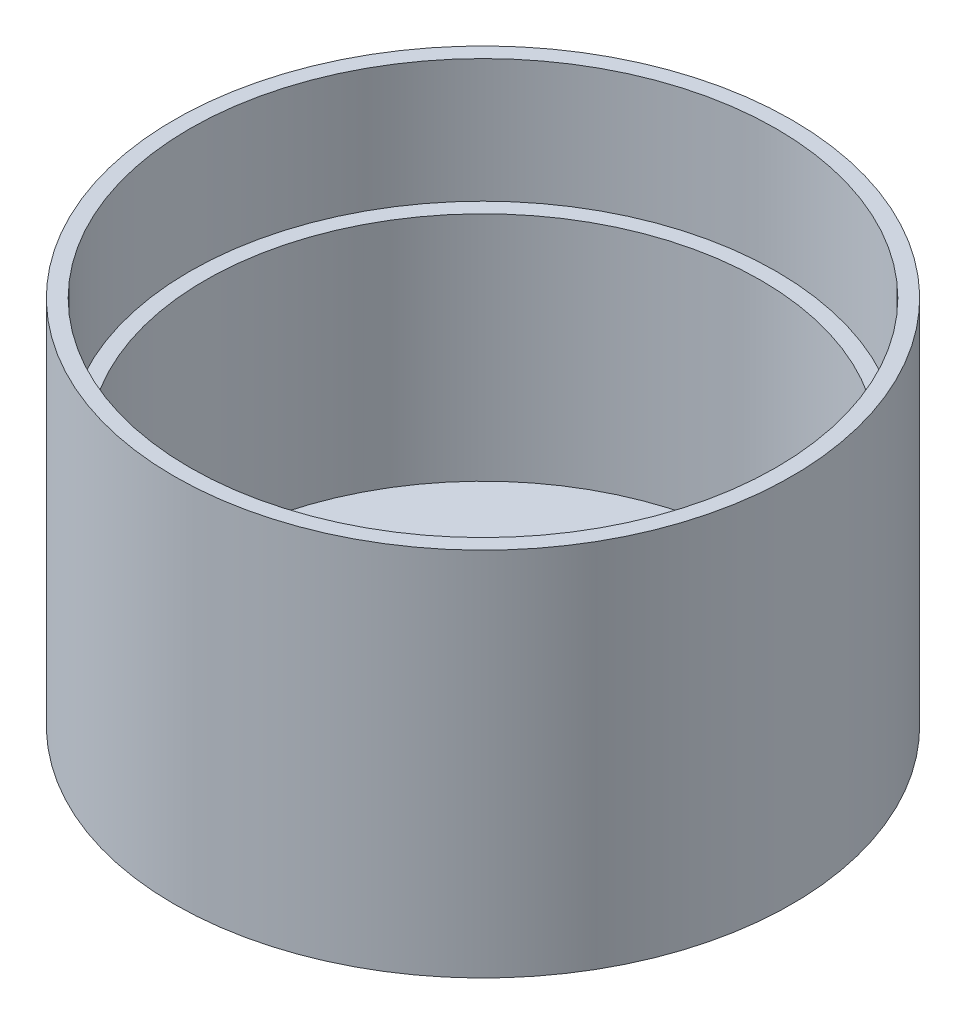
ISO-10303-21;
HEADER;
FILE_DESCRIPTION(('STEP AP214'),'2;1');
FILE_NAME('part.step','',(''),(''),'','','');
FILE_SCHEMA(('AUTOMOTIVE_DESIGN { 1 0 10303 214 1 1 1 1 }'));
ENDSEC;
DATA;
#1=APPLICATION_CONTEXT('core data for automotive mechanical design processes');
#2=APPLICATION_PROTOCOL_DEFINITION('international standard','automotive_design',2000,#1);
#3=PRODUCT_CONTEXT('',#1,'mechanical');
#4=PRODUCT('Part','Part','',(#3));
#5=PRODUCT_RELATED_PRODUCT_CATEGORY('part','',(#4));
#6=PRODUCT_DEFINITION_FORMATION('','',#4);
#7=PRODUCT_DEFINITION_CONTEXT('part definition',#1,'design');
#8=PRODUCT_DEFINITION('design','',#6,#7);
#9=PRODUCT_DEFINITION_SHAPE('','',#8);
#10=(LENGTH_UNIT() NAMED_UNIT(*) SI_UNIT(.MILLI.,.METRE.));
#11=(NAMED_UNIT(*) PLANE_ANGLE_UNIT() SI_UNIT($,.RADIAN.));
#12=(NAMED_UNIT(*) SI_UNIT($,.STERADIAN.) SOLID_ANGLE_UNIT());
#13=UNCERTAINTY_MEASURE_WITH_UNIT(LENGTH_MEASURE(1.E-05),#10,'distance_accuracy_value','');
#14=(GEOMETRIC_REPRESENTATION_CONTEXT(3) GLOBAL_UNCERTAINTY_ASSIGNED_CONTEXT((#13)) GLOBAL_UNIT_ASSIGNED_CONTEXT((#10,
#11,#12)) REPRESENTATION_CONTEXT('',''));
#15=CARTESIAN_POINT('',(0.,0.,0.));
#16=DIRECTION('',(0.,0.,1.));
#17=DIRECTION('',(1.,0.,0.));
#18=AXIS2_PLACEMENT_3D('',#15,#16,#17);
#19=CARTESIAN_POINT('',(0.,76.2,0.));
#20=DIRECTION('',(0.,-1.,0.));
#21=DIRECTION('',(0.,0.,-1.));
#22=AXIS2_PLACEMENT_3D('',#19,#20,#21);
#23=CYLINDRICAL_SURFACE('',#22,63.5);
#24=CARTESIAN_POINT('',(0.,76.2,0.));
#25=DIRECTION('',(0.,1.,0.));
#26=DIRECTION('',(0.,0.,1.));
#27=AXIS2_PLACEMENT_3D('',#24,#25,#26);
#28=CIRCLE('',#27,63.5);
#29=CARTESIAN_POINT('',(0.,76.2,-63.5));
#30=VERTEX_POINT('',#29);
#31=EDGE_CURVE('E10',#30,#30,#28,.T.);
#32=CARTESIAN_POINT('',(0.,0.,0.));
#33=DIRECTION('',(0.,1.,0.));
#34=DIRECTION('',(0.,0.,1.));
#35=AXIS2_PLACEMENT_3D('',#32,#33,#34);
#36=CIRCLE('',#35,63.5);
#37=CARTESIAN_POINT('',(0.,0.,-63.5));
#38=VERTEX_POINT('',#37);
#39=EDGE_CURVE('E49',#38,#38,#36,.T.);
#40=CARTESIAN_POINT('',(0.,76.2,-63.5));
#41=CARTESIAN_POINT('',(0.,75.40625,-63.5));
#42=CARTESIAN_POINT('',(0.,74.6125,-63.5));
#43=CARTESIAN_POINT('',(0.,73.025,-63.5));
#44=CARTESIAN_POINT('',(0.,72.23125,-63.5));
#45=CARTESIAN_POINT('',(0.,70.64375,-63.5));
#46=CARTESIAN_POINT('',(0.,69.85,-63.5));
#47=CARTESIAN_POINT('',(0.,68.2625,-63.5));
#48=CARTESIAN_POINT('',(0.,67.46875,-63.5));
#49=CARTESIAN_POINT('',(0.,65.88125,-63.5));
#50=CARTESIAN_POINT('',(0.,65.0875,-63.5));
#51=CARTESIAN_POINT('',(0.,63.5,-63.5));
#52=CARTESIAN_POINT('',(0.,62.70625,-63.5));
#53=CARTESIAN_POINT('',(0.,61.11875,-63.5));
#54=CARTESIAN_POINT('',(0.,60.325,-63.5));
#55=CARTESIAN_POINT('',(0.,58.7375,-63.5));
#56=CARTESIAN_POINT('',(0.,57.94375,-63.5));
#57=CARTESIAN_POINT('',(0.,56.35625,-63.5));
#58=CARTESIAN_POINT('',(0.,55.5625,-63.5));
#59=CARTESIAN_POINT('',(0.,53.975,-63.5));
#60=CARTESIAN_POINT('',(0.,53.18125,-63.5));
#61=CARTESIAN_POINT('',(0.,51.59375,-63.5));
#62=CARTESIAN_POINT('',(0.,50.8,-63.5));
#63=CARTESIAN_POINT('',(0.,49.2125,-63.5));
#64=CARTESIAN_POINT('',(0.,48.41875,-63.5));
#65=CARTESIAN_POINT('',(0.,46.83125,-63.5));
#66=CARTESIAN_POINT('',(0.,46.0375,-63.5));
#67=CARTESIAN_POINT('',(0.,44.45,-63.5));
#68=CARTESIAN_POINT('',(0.,43.65625,-63.5));
#69=CARTESIAN_POINT('',(0.,42.06875,-63.5));
#70=CARTESIAN_POINT('',(0.,41.275,-63.5));
#71=CARTESIAN_POINT('',(0.,39.6875,-63.5));
#72=CARTESIAN_POINT('',(0.,38.89375,-63.5));
#73=CARTESIAN_POINT('',(0.,37.30625,-63.5));
#74=CARTESIAN_POINT('',(0.,36.5125,-63.5));
#75=CARTESIAN_POINT('',(0.,34.925,-63.5));
#76=CARTESIAN_POINT('',(0.,34.13125,-63.5));
#77=CARTESIAN_POINT('',(0.,32.54375,-63.5));
#78=CARTESIAN_POINT('',(0.,31.75,-63.5));
#79=CARTESIAN_POINT('',(0.,30.1625,-63.5));
#80=CARTESIAN_POINT('',(0.,29.36875,-63.5));
#81=CARTESIAN_POINT('',(0.,27.78125,-63.5));
#82=CARTESIAN_POINT('',(0.,26.9875,-63.5));
#83=CARTESIAN_POINT('',(0.,25.4,-63.5));
#84=CARTESIAN_POINT('',(0.,24.60625,-63.5));
#85=CARTESIAN_POINT('',(0.,23.01875,-63.5));
#86=CARTESIAN_POINT('',(0.,22.225,-63.5));
#87=CARTESIAN_POINT('',(0.,20.6375,-63.5));
#88=CARTESIAN_POINT('',(0.,19.84375,-63.5));
#89=CARTESIAN_POINT('',(0.,18.25625,-63.5));
#90=CARTESIAN_POINT('',(0.,17.4625,-63.5));
#91=CARTESIAN_POINT('',(0.,15.875,-63.5));
#92=CARTESIAN_POINT('',(0.,15.08125,-63.5));
#93=CARTESIAN_POINT('',(0.,13.49375,-63.5));
#94=CARTESIAN_POINT('',(0.,12.7,-63.5));
#95=CARTESIAN_POINT('',(0.,11.1125,-63.5));
#96=CARTESIAN_POINT('',(0.,10.31875,-63.5));
#97=CARTESIAN_POINT('',(0.,8.73125,-63.5));
#98=CARTESIAN_POINT('',(0.,7.93750000000001,-63.5));
#99=CARTESIAN_POINT('',(0.,6.35,-63.5));
#100=CARTESIAN_POINT('',(0.,5.55625,-63.5));
#101=CARTESIAN_POINT('',(0.,3.96875,-63.5));
#102=CARTESIAN_POINT('',(0.,3.175,-63.5));
#103=CARTESIAN_POINT('',(0.,1.5875,-63.5));
#104=CARTESIAN_POINT('',(0.,0.793750000000001,-63.5));
#105=CARTESIAN_POINT('',(0.,0.,-63.5));
#106=B_SPLINE_CURVE_WITH_KNOTS('',3,(#40,#41,#42,#43,#44,#45,#46,#47,#48,#49,#50,#51,#52,#53,
#54,#55,#56,#57,#58,#59,#60,#61,#62,#63,#64,#65,#66,#67,#68,#69,#70,#71,#72,#73,#74,#75,#76,#77,
#78,#79,#80,#81,#82,#83,#84,#85,#86,#87,#88,#89,#90,#91,#92,#93,#94,#95,#96,#97,#98,#99,#100,
#101,#102,#103,#104,#105),.UNSPECIFIED.,.F.,.F.,(4,2,2,2,2,2,2,2,2,2,2,2,2,2,2,2,2,2,2,2,2,2,2,
2,2,2,2,2,2,2,2,2,4),(0.,2.38124999999999,4.76249999999999,7.14374999999999,9.52499999999999,
11.90625,14.2875,16.66875,19.05,21.43125,23.8125,26.19375,28.575,30.95625,33.3375,35.71875,38.1,
40.48125,42.8625,45.24375,47.625,50.00625,52.3875,54.76875,57.15,59.53125,61.9125,64.29375,
66.675,69.05625,71.4375,73.81875,76.2),.UNSPECIFIED.);
#107=EDGE_CURVE('BSEAM41',#30,#38,#106,.T.);
#108=ORIENTED_EDGE('',*,*,#31,.F.);
#109=ORIENTED_EDGE('',*,*,#39,.T.);
#110=ORIENTED_EDGE('',*,*,#107,.T.);
#111=ORIENTED_EDGE('',*,*,#107,.F.);
#112=EDGE_LOOP('',(#108,#110,#109,#111));
#113=FACE_BOUND('',#112,.T.);
#114=ADVANCED_FACE('F41',(#113),#23,.T.);
#115=CARTESIAN_POINT('',(0.,76.2,0.));
#116=DIRECTION('',(0.,1.,0.));
#117=DIRECTION('',(0.,0.,1.));
#118=AXIS2_PLACEMENT_3D('',#115,#116,#117);
#119=PLANE('',#118);
#120=CARTESIAN_POINT('',(0.,76.2,0.));
#121=DIRECTION('',(0.,1.,0.));
#122=DIRECTION('',(0.,0.,1.));
#123=AXIS2_PLACEMENT_3D('',#120,#121,#122);
#124=CIRCLE('',#123,60.325);
#125=CARTESIAN_POINT('',(0.,76.2,60.325));
#126=VERTEX_POINT('',#125);
#127=EDGE_CURVE('E60',#126,#126,#124,.T.);
#128=ORIENTED_EDGE('',*,*,#127,.F.);
#129=EDGE_LOOP('',(#128));
#130=FACE_BOUND('',#129,.T.);
#131=ORIENTED_EDGE('',*,*,#31,.T.);
#132=EDGE_LOOP('',(#131));
#133=FACE_BOUND('',#132,.T.);
#134=ADVANCED_FACE('F89',(#130,#133),#119,.T.);
#135=CARTESIAN_POINT('',(0.,0.,0.));
#136=DIRECTION('',(0.,1.,0.));
#137=DIRECTION('',(0.,0.,1.));
#138=AXIS2_PLACEMENT_3D('',#135,#136,#137);
#139=PLANE('',#138);
#140=ORIENTED_EDGE('',*,*,#39,.F.);
#141=EDGE_LOOP('',(#140));
#142=FACE_BOUND('',#141,.T.);
#143=ADVANCED_FACE('F94',(#142),#139,.F.);
#144=CARTESIAN_POINT('',(0.,50.8,0.));
#145=DIRECTION('',(0.,1.,0.));
#146=DIRECTION('',(0.,0.,1.));
#147=AXIS2_PLACEMENT_3D('',#144,#145,#146);
#148=PLANE('',#147);
#149=CARTESIAN_POINT('',(0.,50.8,0.));
#150=DIRECTION('',(0.,1.,0.));
#151=DIRECTION('',(0.,0.,1.));
#152=AXIS2_PLACEMENT_3D('',#149,#150,#151);
#153=CIRCLE('',#152,60.325);
#154=CARTESIAN_POINT('',(0.,50.8,60.325));
#155=VERTEX_POINT('',#154);
#156=EDGE_CURVE('E64',#155,#155,#153,.T.);
#157=ORIENTED_EDGE('',*,*,#156,.T.);
#158=EDGE_LOOP('',(#157));
#159=FACE_BOUND('',#158,.T.);
#160=CARTESIAN_POINT('',(0.,50.8,0.));
#161=DIRECTION('',(0.,1.,0.));
#162=DIRECTION('',(0.,0.,1.));
#163=AXIS2_PLACEMENT_3D('',#160,#161,#162);
#164=CIRCLE('',#163,57.15);
#165=CARTESIAN_POINT('',(0.,50.8,57.15));
#166=VERTEX_POINT('',#165);
#167=EDGE_CURVE('E44',#166,#166,#164,.F.);
#168=ORIENTED_EDGE('',*,*,#167,.T.);
#169=EDGE_LOOP('',(#168));
#170=FACE_BOUND('',#169,.T.);
#171=ADVANCED_FACE('F73',(#159,#170),#148,.T.);
#172=CARTESIAN_POINT('',(0.,50.8,0.));
#173=DIRECTION('',(0.,1.,0.));
#174=DIRECTION('',(0.,0.,1.));
#175=AXIS2_PLACEMENT_3D('',#172,#173,#174);
#176=CYLINDRICAL_SURFACE('',#175,60.325);
#177=ORIENTED_EDGE('',*,*,#156,.F.);
#178=EDGE_LOOP('',(#177));
#179=FACE_BOUND('',#178,.T.);
#180=ORIENTED_EDGE('',*,*,#127,.T.);
#181=EDGE_LOOP('',(#180));
#182=FACE_BOUND('',#181,.T.);
#183=ADVANCED_FACE('F83',(#179,#182),#176,.F.);
#184=CARTESIAN_POINT('',(0.,3.17500000000001,0.));
#185=DIRECTION('',(0.,1.,0.));
#186=DIRECTION('',(0.,0.,1.));
#187=AXIS2_PLACEMENT_3D('',#184,#185,#186);
#188=PLANE('',#187);
#189=CARTESIAN_POINT('',(0.,3.17500000000001,0.));
#190=DIRECTION('',(0.,1.,0.));
#191=DIRECTION('',(0.,0.,1.));
#192=AXIS2_PLACEMENT_3D('',#189,#190,#191);
#193=CIRCLE('',#192,57.15);
#194=CARTESIAN_POINT('',(0.,3.17500000000001,57.15));
#195=VERTEX_POINT('',#194);
#196=EDGE_CURVE('E55',#195,#195,#193,.T.);
#197=ORIENTED_EDGE('',*,*,#196,.T.);
#198=EDGE_LOOP('',(#197));
#199=FACE_BOUND('',#198,.T.);
#200=ADVANCED_FACE('F77',(#199),#188,.T.);
#201=CARTESIAN_POINT('',(0.,3.17500000000001,0.));
#202=DIRECTION('',(0.,1.,0.));
#203=DIRECTION('',(0.,0.,1.));
#204=AXIS2_PLACEMENT_3D('',#201,#202,#203);
#205=CYLINDRICAL_SURFACE('',#204,57.15);
#206=ORIENTED_EDGE('',*,*,#196,.F.);
#207=EDGE_LOOP('',(#206));
#208=FACE_BOUND('',#207,.T.);
#209=ORIENTED_EDGE('',*,*,#167,.F.);
#210=EDGE_LOOP('',(#209));
#211=FACE_BOUND('',#210,.T.);
#212=ADVANCED_FACE('F75',(#208,#211),#205,.F.);
#213=CLOSED_SHELL('',(#114,#134,#143,#171,#183,#200,#212));
#214=MANIFOLD_SOLID_BREP('B2',#213);
#215=ADVANCED_BREP_SHAPE_REPRESENTATION('',(#18,#214),#14);
#216=SHAPE_DEFINITION_REPRESENTATION(#9,#215);
ENDSEC;
END-ISO-10303-21;
